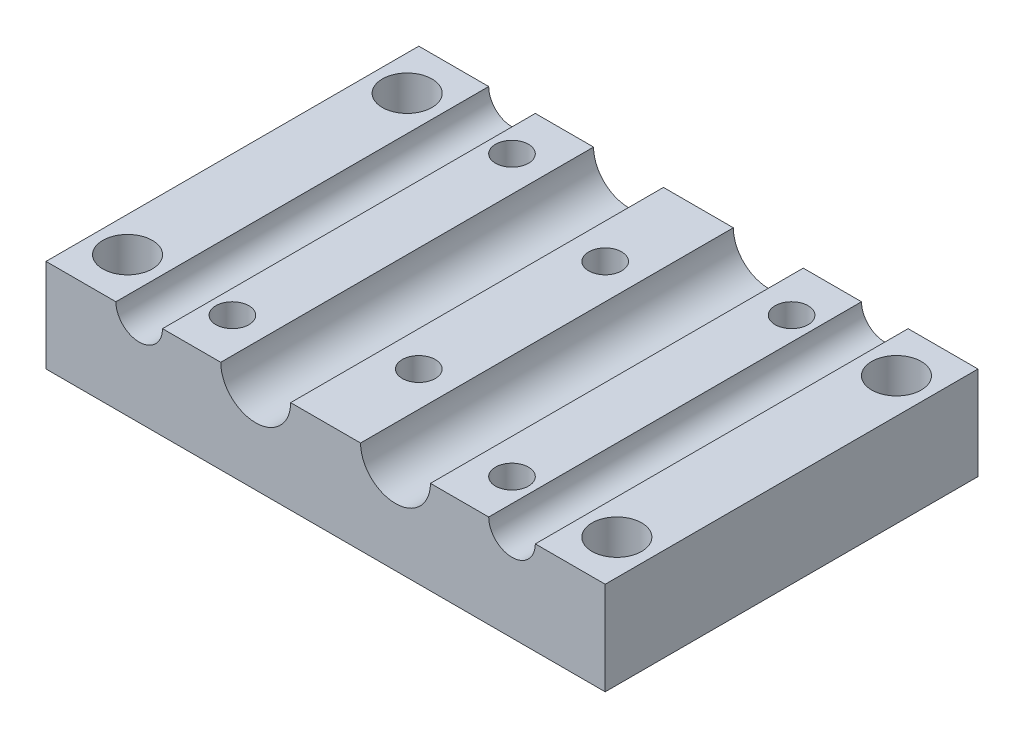
ISO-10303-21;
HEADER;
FILE_DESCRIPTION(('STEP AP214'),'2;1');
FILE_NAME('part.step','',(''),(''),'','','');
FILE_SCHEMA(('AUTOMOTIVE_DESIGN { 1 0 10303 214 1 1 1 1 }'));
ENDSEC;
DATA;
#1=APPLICATION_CONTEXT('core data for automotive mechanical design processes');
#2=APPLICATION_PROTOCOL_DEFINITION('international standard','automotive_design',2000,#1);
#3=PRODUCT_CONTEXT('',#1,'mechanical');
#4=PRODUCT('Part','Part','',(#3));
#5=PRODUCT_RELATED_PRODUCT_CATEGORY('part','',(#4));
#6=PRODUCT_DEFINITION_FORMATION('','',#4);
#7=PRODUCT_DEFINITION_CONTEXT('part definition',#1,'design');
#8=PRODUCT_DEFINITION('design','',#6,#7);
#9=PRODUCT_DEFINITION_SHAPE('','',#8);
#10=(LENGTH_UNIT() NAMED_UNIT(*) SI_UNIT(.MILLI.,.METRE.));
#11=(NAMED_UNIT(*) PLANE_ANGLE_UNIT() SI_UNIT($,.RADIAN.));
#12=(NAMED_UNIT(*) SI_UNIT($,.STERADIAN.) SOLID_ANGLE_UNIT());
#13=UNCERTAINTY_MEASURE_WITH_UNIT(LENGTH_MEASURE(1.E-05),#10,'distance_accuracy_value','');
#14=(GEOMETRIC_REPRESENTATION_CONTEXT(3) GLOBAL_UNCERTAINTY_ASSIGNED_CONTEXT((#13)) GLOBAL_UNIT_ASSIGNED_CONTEXT((#10,
#11,#12)) REPRESENTATION_CONTEXT('',''));
#15=CARTESIAN_POINT('',(0.,0.,0.));
#16=DIRECTION('',(0.,0.,1.));
#17=DIRECTION('',(1.,0.,0.));
#18=AXIS2_PLACEMENT_3D('',#15,#16,#17);
#19=CARTESIAN_POINT('',(0.,12.7,-12.7));
#20=DIRECTION('',(0.,1.,0.));
#21=DIRECTION('',(0.,0.,1.));
#22=AXIS2_PLACEMENT_3D('',#19,#20,#21);
#23=CYLINDRICAL_SURFACE('',#22,2.2479);
#24=CARTESIAN_POINT('',(0.,12.7,-12.7));
#25=DIRECTION('',(0.,1.,0.));
#26=DIRECTION('',(0.,0.,1.));
#27=AXIS2_PLACEMENT_3D('',#24,#25,#26);
#28=CIRCLE('',#27,2.2479);
#29=CARTESIAN_POINT('',(0.,12.7,-10.4521));
#30=VERTEX_POINT('',#29);
#31=EDGE_CURVE('E223',#30,#30,#28,.T.);
#32=ORIENTED_EDGE('',*,*,#31,.T.);
#33=EDGE_LOOP('',(#32));
#34=FACE_BOUND('',#33,.T.);
#35=CARTESIAN_POINT('',(0.,3.175,-12.7));
#36=DIRECTION('',(0.,-1.,0.));
#37=DIRECTION('',(0.,0.,-1.));
#38=AXIS2_PLACEMENT_3D('',#35,#36,#37);
#39=CIRCLE('',#38,2.2479);
#40=CARTESIAN_POINT('',(0.,3.175,-14.9479));
#41=VERTEX_POINT('',#40);
#42=EDGE_CURVE('E38',#41,#41,#39,.F.);
#43=ORIENTED_EDGE('',*,*,#42,.F.);
#44=EDGE_LOOP('',(#43));
#45=FACE_BOUND('',#44,.T.);
#46=ADVANCED_FACE('F34',(#34,#45),#23,.F.);
#47=CARTESIAN_POINT('',(-19.05,12.7,-19.05));
#48=DIRECTION('',(0.,1.,0.));
#49=DIRECTION('',(0.,0.,1.));
#50=AXIS2_PLACEMENT_3D('',#47,#48,#49);
#51=CYLINDRICAL_SURFACE('',#50,2.2479);
#52=CARTESIAN_POINT('',(-19.05,12.7,-19.05));
#53=DIRECTION('',(0.,1.,0.));
#54=DIRECTION('',(0.,0.,1.));
#55=AXIS2_PLACEMENT_3D('',#52,#53,#54);
#56=CIRCLE('',#55,2.2479);
#57=CARTESIAN_POINT('',(-19.05,12.7,-16.8021));
#58=VERTEX_POINT('',#57);
#59=EDGE_CURVE('E226',#58,#58,#56,.T.);
#60=ORIENTED_EDGE('',*,*,#59,.T.);
#61=EDGE_LOOP('',(#60));
#62=FACE_BOUND('',#61,.T.);
#63=CARTESIAN_POINT('',(-19.05,3.175,-19.05));
#64=DIRECTION('',(0.,-1.,0.));
#65=DIRECTION('',(0.,0.,-1.));
#66=AXIS2_PLACEMENT_3D('',#63,#64,#65);
#67=CIRCLE('',#66,2.2479);
#68=CARTESIAN_POINT('',(-19.05,3.175,-21.2979));
#69=VERTEX_POINT('',#68);
#70=EDGE_CURVE('E258',#69,#69,#67,.F.);
#71=ORIENTED_EDGE('',*,*,#70,.F.);
#72=EDGE_LOOP('',(#71));
#73=FACE_BOUND('',#72,.T.);
#74=ADVANCED_FACE('F280',(#62,#73),#51,.F.);
#75=CARTESIAN_POINT('',(19.05,12.7,-19.05));
#76=DIRECTION('',(0.,1.,0.));
#77=DIRECTION('',(0.,0.,1.));
#78=AXIS2_PLACEMENT_3D('',#75,#76,#77);
#79=CYLINDRICAL_SURFACE('',#78,2.2479);
#80=CARTESIAN_POINT('',(19.05,12.7,-19.05));
#81=DIRECTION('',(0.,1.,0.));
#82=DIRECTION('',(0.,0.,1.));
#83=AXIS2_PLACEMENT_3D('',#80,#81,#82);
#84=CIRCLE('',#83,2.2479);
#85=CARTESIAN_POINT('',(19.05,12.7,-16.8021));
#86=VERTEX_POINT('',#85);
#87=EDGE_CURVE('E214',#86,#86,#84,.T.);
#88=ORIENTED_EDGE('',*,*,#87,.T.);
#89=EDGE_LOOP('',(#88));
#90=FACE_BOUND('',#89,.T.);
#91=CARTESIAN_POINT('',(19.05,3.175,-19.05));
#92=DIRECTION('',(0.,-1.,0.));
#93=DIRECTION('',(0.,0.,-1.));
#94=AXIS2_PLACEMENT_3D('',#91,#92,#93);
#95=CIRCLE('',#94,2.2479);
#96=CARTESIAN_POINT('',(19.05,3.175,-21.2979));
#97=VERTEX_POINT('',#96);
#98=EDGE_CURVE('E251',#97,#97,#95,.F.);
#99=ORIENTED_EDGE('',*,*,#98,.F.);
#100=EDGE_LOOP('',(#99));
#101=FACE_BOUND('',#100,.T.);
#102=ADVANCED_FACE('F287',(#90,#101),#79,.F.);
#103=CARTESIAN_POINT('',(19.05,12.7,19.05));
#104=DIRECTION('',(0.,1.,0.));
#105=DIRECTION('',(0.,0.,1.));
#106=AXIS2_PLACEMENT_3D('',#103,#104,#105);
#107=CYLINDRICAL_SURFACE('',#106,2.2479);
#108=CARTESIAN_POINT('',(19.05,12.7,19.05));
#109=DIRECTION('',(0.,1.,0.));
#110=DIRECTION('',(0.,0.,1.));
#111=AXIS2_PLACEMENT_3D('',#108,#109,#110);
#112=CIRCLE('',#111,2.2479);
#113=CARTESIAN_POINT('',(19.05,12.7,21.2979));
#114=VERTEX_POINT('',#113);
#115=EDGE_CURVE('E217',#114,#114,#112,.T.);
#116=ORIENTED_EDGE('',*,*,#115,.T.);
#117=EDGE_LOOP('',(#116));
#118=FACE_BOUND('',#117,.T.);
#119=CARTESIAN_POINT('',(19.05,3.175,19.05));
#120=DIRECTION('',(0.,-1.,0.));
#121=DIRECTION('',(0.,0.,-1.));
#122=AXIS2_PLACEMENT_3D('',#119,#120,#121);
#123=CIRCLE('',#122,2.2479);
#124=CARTESIAN_POINT('',(19.05,3.175,16.8021));
#125=VERTEX_POINT('',#124);
#126=EDGE_CURVE('E244',#125,#125,#123,.F.);
#127=ORIENTED_EDGE('',*,*,#126,.F.);
#128=EDGE_LOOP('',(#127));
#129=FACE_BOUND('',#128,.T.);
#130=ADVANCED_FACE('F296',(#118,#129),#107,.F.);
#131=CARTESIAN_POINT('',(0.,12.7,12.7));
#132=DIRECTION('',(0.,1.,0.));
#133=DIRECTION('',(0.,0.,1.));
#134=AXIS2_PLACEMENT_3D('',#131,#132,#133);
#135=CYLINDRICAL_SURFACE('',#134,2.2479);
#136=CARTESIAN_POINT('',(0.,12.7,12.7));
#137=DIRECTION('',(0.,1.,0.));
#138=DIRECTION('',(0.,0.,1.));
#139=AXIS2_PLACEMENT_3D('',#136,#137,#138);
#140=CIRCLE('',#139,2.2479);
#141=CARTESIAN_POINT('',(0.,12.7,14.9479));
#142=VERTEX_POINT('',#141);
#143=EDGE_CURVE('E220',#142,#142,#140,.T.);
#144=ORIENTED_EDGE('',*,*,#143,.T.);
#145=EDGE_LOOP('',(#144));
#146=FACE_BOUND('',#145,.T.);
#147=CARTESIAN_POINT('',(0.,3.175,12.7));
#148=DIRECTION('',(0.,-1.,0.));
#149=DIRECTION('',(0.,0.,-1.));
#150=AXIS2_PLACEMENT_3D('',#147,#148,#149);
#151=CIRCLE('',#150,2.2479);
#152=CARTESIAN_POINT('',(0.,3.175,10.4521));
#153=VERTEX_POINT('',#152);
#154=EDGE_CURVE('E237',#153,#153,#151,.F.);
#155=ORIENTED_EDGE('',*,*,#154,.F.);
#156=EDGE_LOOP('',(#155));
#157=FACE_BOUND('',#156,.T.);
#158=ADVANCED_FACE('F292',(#146,#157),#135,.F.);
#159=CARTESIAN_POINT('',(-19.05,12.7,19.05));
#160=DIRECTION('',(0.,1.,0.));
#161=DIRECTION('',(0.,0.,1.));
#162=AXIS2_PLACEMENT_3D('',#159,#160,#161);
#163=CYLINDRICAL_SURFACE('',#162,2.2479);
#164=CARTESIAN_POINT('',(-19.05,12.7,19.05));
#165=DIRECTION('',(0.,1.,0.));
#166=DIRECTION('',(0.,0.,1.));
#167=AXIS2_PLACEMENT_3D('',#164,#165,#166);
#168=CIRCLE('',#167,2.2479);
#169=CARTESIAN_POINT('',(-19.05,12.7,21.2979));
#170=VERTEX_POINT('',#169);
#171=EDGE_CURVE('E229',#170,#170,#168,.T.);
#172=ORIENTED_EDGE('',*,*,#171,.T.);
#173=EDGE_LOOP('',(#172));
#174=FACE_BOUND('',#173,.T.);
#175=CARTESIAN_POINT('',(-19.05,3.175,19.05));
#176=DIRECTION('',(0.,-1.,0.));
#177=DIRECTION('',(0.,0.,-1.));
#178=AXIS2_PLACEMENT_3D('',#175,#176,#177);
#179=CIRCLE('',#178,2.2479);
#180=CARTESIAN_POINT('',(-19.05,3.175,16.8021));
#181=VERTEX_POINT('',#180);
#182=EDGE_CURVE('E232',#181,#181,#179,.F.);
#183=ORIENTED_EDGE('',*,*,#182,.F.);
#184=EDGE_LOOP('',(#183));
#185=FACE_BOUND('',#184,.T.);
#186=ADVANCED_FACE('F295',(#174,#185),#163,.F.);
#187=CARTESIAN_POINT('',(0.,12.7,0.));
#188=DIRECTION('',(0.,1.,0.));
#189=DIRECTION('',(0.,0.,1.));
#190=AXIS2_PLACEMENT_3D('',#187,#188,#189);
#191=PLANE('',#190);
#192=ORIENTED_EDGE('',*,*,#31,.F.);
#193=EDGE_LOOP('',(#192));
#194=FACE_BOUND('',#193,.T.);
#195=ORIENTED_EDGE('',*,*,#143,.F.);
#196=EDGE_LOOP('',(#195));
#197=FACE_BOUND('',#196,.T.);
#198=DIRECTION('',(0.,0.,1.));
#199=VECTOR('',#198,1.);
#200=CARTESIAN_POINT('',(4.7625,12.7,-25.4));
#201=LINE('',#200,#199);
#202=CARTESIAN_POINT('',(4.7625,12.7,-25.4));
#203=VERTEX_POINT('',#202);
#204=CARTESIAN_POINT('',(4.7625,12.7,25.4));
#205=VERTEX_POINT('',#204);
#206=EDGE_CURVE('E124',#203,#205,#201,.T.);
#207=ORIENTED_EDGE('',*,*,#206,.F.);
#208=DIRECTION('',(-1.,0.,0.));
#209=VECTOR('',#208,1.);
#210=CARTESIAN_POINT('',(-38.1,12.7,-25.4));
#211=LINE('',#210,#209);
#212=CARTESIAN_POINT('',(-4.7625,12.7,-25.4));
#213=VERTEX_POINT('',#212);
#214=EDGE_CURVE('E58',#203,#213,#211,.T.);
#215=ORIENTED_EDGE('',*,*,#214,.T.);
#216=DIRECTION('',(0.,0.,1.));
#217=VECTOR('',#216,1.);
#218=CARTESIAN_POINT('',(-4.7625,12.7,-25.4));
#219=LINE('',#218,#217);
#220=CARTESIAN_POINT('',(-4.7625,12.7,25.4));
#221=VERTEX_POINT('',#220);
#222=EDGE_CURVE('E184',#221,#213,#219,.F.);
#223=ORIENTED_EDGE('',*,*,#222,.F.);
#224=DIRECTION('',(1.,0.,0.));
#225=VECTOR('',#224,1.);
#226=CARTESIAN_POINT('',(-38.1,12.7,25.4));
#227=LINE('',#226,#225);
#228=EDGE_CURVE('E132',#221,#205,#227,.T.);
#229=ORIENTED_EDGE('',*,*,#228,.T.);
#230=EDGE_LOOP('',(#207,#215,#223,#229));
#231=FACE_BOUND('',#230,.T.);
#232=ADVANCED_FACE('F130',(#194,#197,#231),#191,.T.);
#233=ORIENTED_EDGE('',*,*,#171,.F.);
#234=EDGE_LOOP('',(#233));
#235=FACE_BOUND('',#234,.T.);
#236=ORIENTED_EDGE('',*,*,#59,.F.);
#237=EDGE_LOOP('',(#236));
#238=FACE_BOUND('',#237,.T.);
#239=DIRECTION('',(0.,0.,1.));
#240=VECTOR('',#239,1.);
#241=CARTESIAN_POINT('',(-14.2875,12.7,-25.4));
#242=LINE('',#241,#240);
#243=CARTESIAN_POINT('',(-14.2875,12.7,-25.4));
#244=VERTEX_POINT('',#243);
#245=CARTESIAN_POINT('',(-14.2875,12.7,25.4));
#246=VERTEX_POINT('',#245);
#247=EDGE_CURVE('E180',#244,#246,#242,.T.);
#248=ORIENTED_EDGE('',*,*,#247,.F.);
#249=CARTESIAN_POINT('',(-22.225,12.7,-25.4));
#250=VERTEX_POINT('',#249);
#251=EDGE_CURVE('E139',#244,#250,#211,.T.);
#252=ORIENTED_EDGE('',*,*,#251,.T.);
#253=DIRECTION('',(0.,0.,1.));
#254=VECTOR('',#253,1.);
#255=CARTESIAN_POINT('',(-22.225,12.7,-25.4));
#256=LINE('',#255,#254);
#257=CARTESIAN_POINT('',(-22.225,12.7,25.4));
#258=VERTEX_POINT('',#257);
#259=EDGE_CURVE('E369',#258,#250,#256,.F.);
#260=ORIENTED_EDGE('',*,*,#259,.F.);
#261=EDGE_CURVE('E163',#258,#246,#227,.T.);
#262=ORIENTED_EDGE('',*,*,#261,.T.);
#263=EDGE_LOOP('',(#248,#252,#260,#262));
#264=FACE_BOUND('',#263,.T.);
#265=ADVANCED_FACE('F367',(#235,#238,#264),#191,.T.);
#266=ORIENTED_EDGE('',*,*,#115,.F.);
#267=EDGE_LOOP('',(#266));
#268=FACE_BOUND('',#267,.T.);
#269=ORIENTED_EDGE('',*,*,#87,.F.);
#270=EDGE_LOOP('',(#269));
#271=FACE_BOUND('',#270,.T.);
#272=DIRECTION('',(0.,0.,1.));
#273=VECTOR('',#272,1.);
#274=CARTESIAN_POINT('',(14.2875,12.7,-25.4));
#275=LINE('',#274,#273);
#276=CARTESIAN_POINT('',(14.2875,12.7,25.4));
#277=VERTEX_POINT('',#276);
#278=CARTESIAN_POINT('',(14.2875,12.7,-25.4));
#279=VERTEX_POINT('',#278);
#280=EDGE_CURVE('E51',#277,#279,#275,.F.);
#281=ORIENTED_EDGE('',*,*,#280,.F.);
#282=CARTESIAN_POINT('',(22.225,12.7,25.4));
#283=VERTEX_POINT('',#282);
#284=EDGE_CURVE('E165',#277,#283,#227,.T.);
#285=ORIENTED_EDGE('',*,*,#284,.T.);
#286=DIRECTION('',(0.,0.,1.));
#287=VECTOR('',#286,1.);
#288=CARTESIAN_POINT('',(22.225,12.7,-25.4));
#289=LINE('',#288,#287);
#290=CARTESIAN_POINT('',(22.225,12.7,-25.4));
#291=VERTEX_POINT('',#290);
#292=EDGE_CURVE('E372',#291,#283,#289,.T.);
#293=ORIENTED_EDGE('',*,*,#292,.F.);
#294=EDGE_CURVE('E138',#291,#279,#211,.T.);
#295=ORIENTED_EDGE('',*,*,#294,.T.);
#296=EDGE_LOOP('',(#281,#285,#293,#295));
#297=FACE_BOUND('',#296,.T.);
#298=ADVANCED_FACE('F446',(#268,#271,#297),#191,.T.);
#299=CARTESIAN_POINT('',(-33.3375,12.7,19.05));
#300=DIRECTION('',(0.,1.,0.));
#301=DIRECTION('',(0.,0.,1.));
#302=AXIS2_PLACEMENT_3D('',#299,#300,#301);
#303=CIRCLE('',#302,3.37819999999999);
#304=CARTESIAN_POINT('',(-33.3375,12.7,22.4282));
#305=VERTEX_POINT('',#304);
#306=EDGE_CURVE('E211',#305,#305,#303,.T.);
#307=ORIENTED_EDGE('',*,*,#306,.F.);
#308=EDGE_LOOP('',(#307));
#309=FACE_BOUND('',#308,.T.);
#310=CARTESIAN_POINT('',(-33.3375,12.7,-19.05));
#311=DIRECTION('',(0.,1.,0.));
#312=DIRECTION('',(0.,0.,1.));
#313=AXIS2_PLACEMENT_3D('',#310,#311,#312);
#314=CIRCLE('',#313,3.37819999999999);
#315=CARTESIAN_POINT('',(-33.3375,12.7,-15.6718));
#316=VERTEX_POINT('',#315);
#317=EDGE_CURVE('E205',#316,#316,#314,.T.);
#318=ORIENTED_EDGE('',*,*,#317,.F.);
#319=EDGE_LOOP('',(#318));
#320=FACE_BOUND('',#319,.T.);
#321=DIRECTION('',(0.,0.,1.));
#322=VECTOR('',#321,1.);
#323=CARTESIAN_POINT('',(-28.575,12.7,-25.4));
#324=LINE('',#323,#322);
#325=CARTESIAN_POINT('',(-28.575,12.7,-25.4));
#326=VERTEX_POINT('',#325);
#327=CARTESIAN_POINT('',(-28.575,12.7,25.4));
#328=VERTEX_POINT('',#327);
#329=EDGE_CURVE('E460',#326,#328,#324,.T.);
#330=ORIENTED_EDGE('',*,*,#329,.F.);
#331=CARTESIAN_POINT('',(-38.1,12.7,-25.4));
#332=VERTEX_POINT('',#331);
#333=EDGE_CURVE('E142',#326,#332,#211,.T.);
#334=ORIENTED_EDGE('',*,*,#333,.T.);
#335=DIRECTION('',(0.,0.,1.));
#336=VECTOR('',#335,1.);
#337=CARTESIAN_POINT('',(-38.1,12.7,-25.4));
#338=LINE('',#337,#336);
#339=CARTESIAN_POINT('',(-38.1,12.7,25.4));
#340=VERTEX_POINT('',#339);
#341=EDGE_CURVE('E167',#332,#340,#338,.T.);
#342=ORIENTED_EDGE('',*,*,#341,.T.);
#343=EDGE_CURVE('E159',#340,#328,#227,.T.);
#344=ORIENTED_EDGE('',*,*,#343,.T.);
#345=EDGE_LOOP('',(#330,#334,#342,#344));
#346=FACE_BOUND('',#345,.T.);
#347=ADVANCED_FACE('F339',(#309,#320,#346),#191,.T.);
#348=CARTESIAN_POINT('',(-38.1,12.7,-25.4));
#349=DIRECTION('',(1.,0.,0.));
#350=DIRECTION('',(0.,0.,-1.));
#351=AXIS2_PLACEMENT_3D('',#348,#349,#350);
#352=PLANE('',#351);
#353=DIRECTION('',(0.,0.,1.));
#354=VECTOR('',#353,1.);
#355=CARTESIAN_POINT('',(-38.1,0.,-25.4));
#356=LINE('',#355,#354);
#357=CARTESIAN_POINT('',(-38.1,0.,-25.4));
#358=VERTEX_POINT('',#357);
#359=CARTESIAN_POINT('',(-38.1,0.,25.4));
#360=VERTEX_POINT('',#359);
#361=EDGE_CURVE('E177',#358,#360,#356,.T.);
#362=ORIENTED_EDGE('',*,*,#361,.T.);
#363=DIRECTION('',(0.,-1.,0.));
#364=VECTOR('',#363,1.);
#365=CARTESIAN_POINT('',(-38.1,12.7,25.4));
#366=LINE('',#365,#364);
#367=EDGE_CURVE('E464',#340,#360,#366,.T.);
#368=ORIENTED_EDGE('',*,*,#367,.F.);
#369=ORIENTED_EDGE('',*,*,#341,.F.);
#370=DIRECTION('',(0.,-1.,0.));
#371=VECTOR('',#370,1.);
#372=CARTESIAN_POINT('',(-38.1,12.7,-25.4));
#373=LINE('',#372,#371);
#374=EDGE_CURVE('E146',#332,#358,#373,.T.);
#375=ORIENTED_EDGE('',*,*,#374,.T.);
#376=EDGE_LOOP('',(#362,#368,#369,#375));
#377=FACE_BOUND('',#376,.T.);
#378=ADVANCED_FACE('F36',(#377),#352,.F.);
#379=CARTESIAN_POINT('',(-38.1,12.7,25.4));
#380=DIRECTION('',(0.,0.,-1.));
#381=DIRECTION('',(-1.,0.,0.));
#382=AXIS2_PLACEMENT_3D('',#379,#380,#381);
#383=PLANE('',#382);
#384=ORIENTED_EDGE('',*,*,#284,.F.);
#385=CARTESIAN_POINT('',(9.525,12.7,25.4));
#386=DIRECTION('',(0.,0.,1.));
#387=DIRECTION('',(1.,0.,0.));
#388=AXIS2_PLACEMENT_3D('',#385,#386,#387);
#389=CIRCLE('',#388,4.7625);
#390=EDGE_CURVE('E188',#205,#277,#389,.T.);
#391=ORIENTED_EDGE('',*,*,#390,.F.);
#392=ORIENTED_EDGE('',*,*,#228,.F.);
#393=CARTESIAN_POINT('',(-9.525,12.7,25.4));
#394=DIRECTION('',(0.,0.,1.));
#395=DIRECTION('',(1.,0.,0.));
#396=AXIS2_PLACEMENT_3D('',#393,#394,#395);
#397=CIRCLE('',#396,4.7625);
#398=EDGE_CURVE('E133',#246,#221,#397,.T.);
#399=ORIENTED_EDGE('',*,*,#398,.F.);
#400=ORIENTED_EDGE('',*,*,#261,.F.);
#401=CARTESIAN_POINT('',(-25.4,12.7,25.4));
#402=DIRECTION('',(0.,0.,1.));
#403=DIRECTION('',(1.,0.,0.));
#404=AXIS2_PLACEMENT_3D('',#401,#402,#403);
#405=CIRCLE('',#404,3.175);
#406=EDGE_CURVE('E171',#328,#258,#405,.T.);
#407=ORIENTED_EDGE('',*,*,#406,.F.);
#408=ORIENTED_EDGE('',*,*,#343,.F.);
#409=ORIENTED_EDGE('',*,*,#367,.T.);
#410=DIRECTION('',(1.,0.,0.));
#411=VECTOR('',#410,1.);
#412=CARTESIAN_POINT('',(-38.1,0.,25.4));
#413=LINE('',#412,#411);
#414=CARTESIAN_POINT('',(38.1,0.,25.4));
#415=VERTEX_POINT('',#414);
#416=EDGE_CURVE('E474',#360,#415,#413,.T.);
#417=ORIENTED_EDGE('',*,*,#416,.T.);
#418=DIRECTION('',(0.,-1.,0.));
#419=VECTOR('',#418,1.);
#420=CARTESIAN_POINT('',(38.1,12.7,25.4));
#421=LINE('',#420,#419);
#422=CARTESIAN_POINT('',(38.1,12.7,25.4));
#423=VERTEX_POINT('',#422);
#424=EDGE_CURVE('E467',#423,#415,#421,.T.);
#425=ORIENTED_EDGE('',*,*,#424,.F.);
#426=CARTESIAN_POINT('',(28.575,12.7,25.4));
#427=VERTEX_POINT('',#426);
#428=EDGE_CURVE('E169',#427,#423,#227,.T.);
#429=ORIENTED_EDGE('',*,*,#428,.F.);
#430=CARTESIAN_POINT('',(25.4,12.7,25.4));
#431=DIRECTION('',(0.,0.,1.));
#432=DIRECTION('',(1.,0.,0.));
#433=AXIS2_PLACEMENT_3D('',#430,#431,#432);
#434=CIRCLE('',#433,3.175);
#435=EDGE_CURVE('E178',#283,#427,#434,.T.);
#436=ORIENTED_EDGE('',*,*,#435,.F.);
#437=EDGE_LOOP('',(#384,#391,#392,#399,#400,#407,#408,#409,#417,#425,#429,#436));
#438=FACE_BOUND('',#437,.T.);
#439=ADVANCED_FACE('F347',(#438),#383,.F.);
#440=CARTESIAN_POINT('',(38.1,12.7,-25.4));
#441=DIRECTION('',(-1.,0.,0.));
#442=DIRECTION('',(0.,0.,1.));
#443=AXIS2_PLACEMENT_3D('',#440,#441,#442);
#444=PLANE('',#443);
#445=DIRECTION('',(0.,0.,-1.));
#446=VECTOR('',#445,1.);
#447=CARTESIAN_POINT('',(38.1,0.,-25.4));
#448=LINE('',#447,#446);
#449=CARTESIAN_POINT('',(38.1,0.,-25.4));
#450=VERTEX_POINT('',#449);
#451=EDGE_CURVE('E472',#415,#450,#448,.T.);
#452=ORIENTED_EDGE('',*,*,#451,.T.);
#453=DIRECTION('',(0.,-1.,0.));
#454=VECTOR('',#453,1.);
#455=CARTESIAN_POINT('',(38.1,12.7,-25.4));
#456=LINE('',#455,#454);
#457=CARTESIAN_POINT('',(38.1,12.7,-25.4));
#458=VERTEX_POINT('',#457);
#459=EDGE_CURVE('E151',#458,#450,#456,.T.);
#460=ORIENTED_EDGE('',*,*,#459,.F.);
#461=DIRECTION('',(0.,0.,-1.));
#462=VECTOR('',#461,1.);
#463=CARTESIAN_POINT('',(38.1,12.7,-25.4));
#464=LINE('',#463,#462);
#465=EDGE_CURVE('E153',#423,#458,#464,.T.);
#466=ORIENTED_EDGE('',*,*,#465,.F.);
#467=ORIENTED_EDGE('',*,*,#424,.T.);
#468=EDGE_LOOP('',(#452,#460,#466,#467));
#469=FACE_BOUND('',#468,.T.);
#470=ADVANCED_FACE('F345',(#469),#444,.F.);
#471=CARTESIAN_POINT('',(-38.1,12.7,-25.4));
#472=DIRECTION('',(0.,0.,1.));
#473=DIRECTION('',(1.,0.,0.));
#474=AXIS2_PLACEMENT_3D('',#471,#472,#473);
#475=PLANE('',#474);
#476=ORIENTED_EDGE('',*,*,#214,.F.);
#477=CARTESIAN_POINT('',(9.525,12.7,-25.4));
#478=DIRECTION('',(0.,0.,1.));
#479=DIRECTION('',(1.,0.,0.));
#480=AXIS2_PLACEMENT_3D('',#477,#478,#479);
#481=CIRCLE('',#480,4.7625);
#482=EDGE_CURVE('E11',#203,#279,#481,.T.);
#483=ORIENTED_EDGE('',*,*,#482,.T.);
#484=ORIENTED_EDGE('',*,*,#294,.F.);
#485=CARTESIAN_POINT('',(25.4,12.7,-25.4));
#486=DIRECTION('',(0.,0.,1.));
#487=DIRECTION('',(1.,0.,0.));
#488=AXIS2_PLACEMENT_3D('',#485,#486,#487);
#489=CIRCLE('',#488,3.175);
#490=CARTESIAN_POINT('',(28.575,12.7,-25.4));
#491=VERTEX_POINT('',#490);
#492=EDGE_CURVE('E174',#291,#491,#489,.T.);
#493=ORIENTED_EDGE('',*,*,#492,.T.);
#494=EDGE_CURVE('E141',#458,#491,#211,.T.);
#495=ORIENTED_EDGE('',*,*,#494,.F.);
#496=ORIENTED_EDGE('',*,*,#459,.T.);
#497=DIRECTION('',(-1.,0.,0.));
#498=VECTOR('',#497,1.);
#499=CARTESIAN_POINT('',(-38.1,0.,-25.4));
#500=LINE('',#499,#498);
#501=EDGE_CURVE('E170',#450,#358,#500,.T.);
#502=ORIENTED_EDGE('',*,*,#501,.T.);
#503=ORIENTED_EDGE('',*,*,#374,.F.);
#504=ORIENTED_EDGE('',*,*,#333,.F.);
#505=CARTESIAN_POINT('',(-25.4,12.7,-25.4));
#506=DIRECTION('',(0.,0.,1.));
#507=DIRECTION('',(1.,0.,0.));
#508=AXIS2_PLACEMENT_3D('',#505,#506,#507);
#509=CIRCLE('',#508,3.175);
#510=EDGE_CURVE('E173',#326,#250,#509,.T.);
#511=ORIENTED_EDGE('',*,*,#510,.T.);
#512=ORIENTED_EDGE('',*,*,#251,.F.);
#513=CARTESIAN_POINT('',(-9.525,12.7,-25.4));
#514=DIRECTION('',(0.,0.,1.));
#515=DIRECTION('',(1.,0.,0.));
#516=AXIS2_PLACEMENT_3D('',#513,#514,#515);
#517=CIRCLE('',#516,4.7625);
#518=EDGE_CURVE('E43',#244,#213,#517,.T.);
#519=ORIENTED_EDGE('',*,*,#518,.T.);
#520=EDGE_LOOP('',(#476,#483,#484,#493,#495,#496,#502,#503,#504,#511,#512,#519));
#521=FACE_BOUND('',#520,.T.);
#522=ADVANCED_FACE('F136',(#521),#475,.F.);
#523=CARTESIAN_POINT('',(33.3375,12.7,-19.05));
#524=DIRECTION('',(0.,1.,0.));
#525=DIRECTION('',(0.,0.,1.));
#526=AXIS2_PLACEMENT_3D('',#523,#524,#525);
#527=CIRCLE('',#526,3.37819999999999);
#528=CARTESIAN_POINT('',(33.3375,12.7,-15.6718));
#529=VERTEX_POINT('',#528);
#530=EDGE_CURVE('E199',#529,#529,#527,.T.);
#531=ORIENTED_EDGE('',*,*,#530,.F.);
#532=EDGE_LOOP('',(#531));
#533=FACE_BOUND('',#532,.T.);
#534=CARTESIAN_POINT('',(33.3375,12.7,19.05));
#535=DIRECTION('',(0.,1.,0.));
#536=DIRECTION('',(0.,0.,1.));
#537=AXIS2_PLACEMENT_3D('',#534,#535,#536);
#538=CIRCLE('',#537,3.37819999999999);
#539=CARTESIAN_POINT('',(33.3375,12.7,22.4282));
#540=VERTEX_POINT('',#539);
#541=EDGE_CURVE('E193',#540,#540,#538,.T.);
#542=ORIENTED_EDGE('',*,*,#541,.F.);
#543=EDGE_LOOP('',(#542));
#544=FACE_BOUND('',#543,.T.);
#545=DIRECTION('',(0.,0.,1.));
#546=VECTOR('',#545,1.);
#547=CARTESIAN_POINT('',(28.575,12.7,-25.4));
#548=LINE('',#547,#546);
#549=EDGE_CURVE('E374',#427,#491,#548,.F.);
#550=ORIENTED_EDGE('',*,*,#549,.F.);
#551=ORIENTED_EDGE('',*,*,#428,.T.);
#552=ORIENTED_EDGE('',*,*,#465,.T.);
#553=ORIENTED_EDGE('',*,*,#494,.T.);
#554=EDGE_LOOP('',(#550,#551,#552,#553));
#555=FACE_BOUND('',#554,.T.);
#556=ADVANCED_FACE('F335',(#533,#544,#555),#191,.T.);
#557=CARTESIAN_POINT('',(0.,0.,0.));
#558=DIRECTION('',(0.,1.,0.));
#559=DIRECTION('',(0.,0.,1.));
#560=AXIS2_PLACEMENT_3D('',#557,#558,#559);
#561=PLANE('',#560);
#562=CARTESIAN_POINT('',(0.,0.,-12.7));
#563=DIRECTION('',(0.,-1.,0.));
#564=DIRECTION('',(0.,0.,-1.));
#565=AXIS2_PLACEMENT_3D('',#562,#563,#564);
#566=CIRCLE('',#565,6.096);
#567=CARTESIAN_POINT('',(0.,0.,-18.796));
#568=VERTEX_POINT('',#567);
#569=EDGE_CURVE('E267',#568,#568,#566,.T.);
#570=ORIENTED_EDGE('',*,*,#569,.F.);
#571=EDGE_LOOP('',(#570));
#572=FACE_BOUND('',#571,.T.);
#573=CARTESIAN_POINT('',(-19.05,0.,-19.05));
#574=DIRECTION('',(0.,-1.,0.));
#575=DIRECTION('',(0.,0.,-1.));
#576=AXIS2_PLACEMENT_3D('',#573,#574,#575);
#577=CIRCLE('',#576,6.096);
#578=CARTESIAN_POINT('',(-19.05,0.,-25.146));
#579=VERTEX_POINT('',#578);
#580=EDGE_CURVE('E261',#579,#579,#577,.T.);
#581=ORIENTED_EDGE('',*,*,#580,.F.);
#582=EDGE_LOOP('',(#581));
#583=FACE_BOUND('',#582,.T.);
#584=CARTESIAN_POINT('',(19.05,0.,-19.05));
#585=DIRECTION('',(0.,-1.,0.));
#586=DIRECTION('',(0.,0.,-1.));
#587=AXIS2_PLACEMENT_3D('',#584,#585,#586);
#588=CIRCLE('',#587,6.096);
#589=CARTESIAN_POINT('',(19.05,0.,-25.146));
#590=VERTEX_POINT('',#589);
#591=EDGE_CURVE('E254',#590,#590,#588,.T.);
#592=ORIENTED_EDGE('',*,*,#591,.F.);
#593=EDGE_LOOP('',(#592));
#594=FACE_BOUND('',#593,.T.);
#595=CARTESIAN_POINT('',(19.05,0.,19.05));
#596=DIRECTION('',(0.,-1.,0.));
#597=DIRECTION('',(0.,0.,-1.));
#598=AXIS2_PLACEMENT_3D('',#595,#596,#597);
#599=CIRCLE('',#598,6.096);
#600=CARTESIAN_POINT('',(19.05,0.,12.954));
#601=VERTEX_POINT('',#600);
#602=EDGE_CURVE('E247',#601,#601,#599,.T.);
#603=ORIENTED_EDGE('',*,*,#602,.F.);
#604=EDGE_LOOP('',(#603));
#605=FACE_BOUND('',#604,.T.);
#606=CARTESIAN_POINT('',(0.,0.,12.7));
#607=DIRECTION('',(0.,-1.,0.));
#608=DIRECTION('',(0.,0.,-1.));
#609=AXIS2_PLACEMENT_3D('',#606,#607,#608);
#610=CIRCLE('',#609,6.096);
#611=CARTESIAN_POINT('',(0.,0.,6.604));
#612=VERTEX_POINT('',#611);
#613=EDGE_CURVE('E240',#612,#612,#610,.T.);
#614=ORIENTED_EDGE('',*,*,#613,.F.);
#615=EDGE_LOOP('',(#614));
#616=FACE_BOUND('',#615,.T.);
#617=CARTESIAN_POINT('',(-19.05,0.,19.05));
#618=DIRECTION('',(0.,-1.,0.));
#619=DIRECTION('',(0.,0.,-1.));
#620=AXIS2_PLACEMENT_3D('',#617,#618,#619);
#621=CIRCLE('',#620,6.096);
#622=CARTESIAN_POINT('',(-19.05,0.,12.954));
#623=VERTEX_POINT('',#622);
#624=EDGE_CURVE('E233',#623,#623,#621,.T.);
#625=ORIENTED_EDGE('',*,*,#624,.F.);
#626=EDGE_LOOP('',(#625));
#627=FACE_BOUND('',#626,.T.);
#628=CARTESIAN_POINT('',(-33.3375,0.,19.05));
#629=DIRECTION('',(0.,1.,0.));
#630=DIRECTION('',(0.,0.,1.));
#631=AXIS2_PLACEMENT_3D('',#628,#629,#630);
#632=CIRCLE('',#631,3.37819999999999);
#633=CARTESIAN_POINT('',(-33.3375,0.,22.4282));
#634=VERTEX_POINT('',#633);
#635=EDGE_CURVE('E208',#634,#634,#632,.T.);
#636=ORIENTED_EDGE('',*,*,#635,.T.);
#637=EDGE_LOOP('',(#636));
#638=FACE_BOUND('',#637,.T.);
#639=CARTESIAN_POINT('',(-33.3375,0.,-19.05));
#640=DIRECTION('',(0.,1.,0.));
#641=DIRECTION('',(0.,0.,1.));
#642=AXIS2_PLACEMENT_3D('',#639,#640,#641);
#643=CIRCLE('',#642,3.37819999999999);
#644=CARTESIAN_POINT('',(-33.3375,0.,-15.6718));
#645=VERTEX_POINT('',#644);
#646=EDGE_CURVE('E202',#645,#645,#643,.T.);
#647=ORIENTED_EDGE('',*,*,#646,.T.);
#648=EDGE_LOOP('',(#647));
#649=FACE_BOUND('',#648,.T.);
#650=CARTESIAN_POINT('',(33.3375,0.,-19.05));
#651=DIRECTION('',(0.,1.,0.));
#652=DIRECTION('',(0.,0.,1.));
#653=AXIS2_PLACEMENT_3D('',#650,#651,#652);
#654=CIRCLE('',#653,3.37819999999999);
#655=CARTESIAN_POINT('',(33.3375,0.,-15.6718));
#656=VERTEX_POINT('',#655);
#657=EDGE_CURVE('E196',#656,#656,#654,.T.);
#658=ORIENTED_EDGE('',*,*,#657,.T.);
#659=EDGE_LOOP('',(#658));
#660=FACE_BOUND('',#659,.T.);
#661=CARTESIAN_POINT('',(33.3375,0.,19.05));
#662=DIRECTION('',(0.,1.,0.));
#663=DIRECTION('',(0.,0.,1.));
#664=AXIS2_PLACEMENT_3D('',#661,#662,#663);
#665=CIRCLE('',#664,3.37819999999999);
#666=CARTESIAN_POINT('',(33.3375,0.,22.4282));
#667=VERTEX_POINT('',#666);
#668=EDGE_CURVE('E190',#667,#667,#665,.T.);
#669=ORIENTED_EDGE('',*,*,#668,.T.);
#670=EDGE_LOOP('',(#669));
#671=FACE_BOUND('',#670,.T.);
#672=ORIENTED_EDGE('',*,*,#361,.F.);
#673=ORIENTED_EDGE('',*,*,#501,.F.);
#674=ORIENTED_EDGE('',*,*,#451,.F.);
#675=ORIENTED_EDGE('',*,*,#416,.F.);
#676=EDGE_LOOP('',(#672,#673,#674,#675));
#677=FACE_BOUND('',#676,.T.);
#678=ADVANCED_FACE('F333',(#572,#583,#594,#605,#616,#627,#638,#649,#660,#671,#677),#561,.F.);
#679=CARTESIAN_POINT('',(-25.4,12.7,-25.4));
#680=DIRECTION('',(0.,0.,1.));
#681=DIRECTION('',(1.,0.,0.));
#682=AXIS2_PLACEMENT_3D('',#679,#680,#681);
#683=CYLINDRICAL_SURFACE('',#682,3.175);
#684=ORIENTED_EDGE('',*,*,#329,.T.);
#685=ORIENTED_EDGE('',*,*,#406,.T.);
#686=ORIENTED_EDGE('',*,*,#259,.T.);
#687=ORIENTED_EDGE('',*,*,#510,.F.);
#688=EDGE_LOOP('',(#684,#685,#686,#687));
#689=FACE_BOUND('',#688,.T.);
#690=ADVANCED_FACE('F329',(#689),#683,.F.);
#691=CARTESIAN_POINT('',(25.4,12.7,-25.4));
#692=DIRECTION('',(0.,0.,1.));
#693=DIRECTION('',(1.,0.,0.));
#694=AXIS2_PLACEMENT_3D('',#691,#692,#693);
#695=CYLINDRICAL_SURFACE('',#694,3.175);
#696=ORIENTED_EDGE('',*,*,#292,.T.);
#697=ORIENTED_EDGE('',*,*,#435,.T.);
#698=ORIENTED_EDGE('',*,*,#549,.T.);
#699=ORIENTED_EDGE('',*,*,#492,.F.);
#700=EDGE_LOOP('',(#696,#697,#698,#699));
#701=FACE_BOUND('',#700,.T.);
#702=ADVANCED_FACE('F325',(#701),#695,.F.);
#703=CARTESIAN_POINT('',(-9.525,12.7,-25.4));
#704=DIRECTION('',(0.,0.,1.));
#705=DIRECTION('',(1.,0.,0.));
#706=AXIS2_PLACEMENT_3D('',#703,#704,#705);
#707=CYLINDRICAL_SURFACE('',#706,4.7625);
#708=ORIENTED_EDGE('',*,*,#247,.T.);
#709=ORIENTED_EDGE('',*,*,#398,.T.);
#710=ORIENTED_EDGE('',*,*,#222,.T.);
#711=ORIENTED_EDGE('',*,*,#518,.F.);
#712=EDGE_LOOP('',(#708,#709,#710,#711));
#713=FACE_BOUND('',#712,.T.);
#714=ADVANCED_FACE('F322',(#713),#707,.F.);
#715=CARTESIAN_POINT('',(9.525,12.7,-25.4));
#716=DIRECTION('',(0.,0.,1.));
#717=DIRECTION('',(1.,0.,0.));
#718=AXIS2_PLACEMENT_3D('',#715,#716,#717);
#719=CYLINDRICAL_SURFACE('',#718,4.7625);
#720=ORIENTED_EDGE('',*,*,#206,.T.);
#721=ORIENTED_EDGE('',*,*,#390,.T.);
#722=ORIENTED_EDGE('',*,*,#280,.T.);
#723=ORIENTED_EDGE('',*,*,#482,.F.);
#724=EDGE_LOOP('',(#720,#721,#722,#723));
#725=FACE_BOUND('',#724,.T.);
#726=ADVANCED_FACE('F123',(#725),#719,.F.);
#727=CARTESIAN_POINT('',(33.3375,12.7,19.05));
#728=DIRECTION('',(0.,1.,0.));
#729=DIRECTION('',(0.,0.,1.));
#730=AXIS2_PLACEMENT_3D('',#727,#728,#729);
#731=CYLINDRICAL_SURFACE('',#730,3.37819999999999);
#732=ORIENTED_EDGE('',*,*,#668,.F.);
#733=EDGE_LOOP('',(#732));
#734=FACE_BOUND('',#733,.T.);
#735=ORIENTED_EDGE('',*,*,#541,.T.);
#736=EDGE_LOOP('',(#735));
#737=FACE_BOUND('',#736,.T.);
#738=ADVANCED_FACE('F315',(#734,#737),#731,.F.);
#739=CARTESIAN_POINT('',(33.3375,12.7,-19.05));
#740=DIRECTION('',(0.,1.,0.));
#741=DIRECTION('',(0.,0.,1.));
#742=AXIS2_PLACEMENT_3D('',#739,#740,#741);
#743=CYLINDRICAL_SURFACE('',#742,3.37819999999999);
#744=ORIENTED_EDGE('',*,*,#657,.F.);
#745=EDGE_LOOP('',(#744));
#746=FACE_BOUND('',#745,.T.);
#747=ORIENTED_EDGE('',*,*,#530,.T.);
#748=EDGE_LOOP('',(#747));
#749=FACE_BOUND('',#748,.T.);
#750=ADVANCED_FACE('F311',(#746,#749),#743,.F.);
#751=CARTESIAN_POINT('',(-33.3375,12.7,-19.05));
#752=DIRECTION('',(0.,1.,0.));
#753=DIRECTION('',(0.,0.,1.));
#754=AXIS2_PLACEMENT_3D('',#751,#752,#753);
#755=CYLINDRICAL_SURFACE('',#754,3.37819999999999);
#756=ORIENTED_EDGE('',*,*,#646,.F.);
#757=EDGE_LOOP('',(#756));
#758=FACE_BOUND('',#757,.T.);
#759=ORIENTED_EDGE('',*,*,#317,.T.);
#760=EDGE_LOOP('',(#759));
#761=FACE_BOUND('',#760,.T.);
#762=ADVANCED_FACE('F307',(#758,#761),#755,.F.);
#763=CARTESIAN_POINT('',(-33.3375,12.7,19.05));
#764=DIRECTION('',(0.,1.,0.));
#765=DIRECTION('',(0.,0.,1.));
#766=AXIS2_PLACEMENT_3D('',#763,#764,#765);
#767=CYLINDRICAL_SURFACE('',#766,3.37819999999999);
#768=ORIENTED_EDGE('',*,*,#635,.F.);
#769=EDGE_LOOP('',(#768));
#770=FACE_BOUND('',#769,.T.);
#771=ORIENTED_EDGE('',*,*,#306,.T.);
#772=EDGE_LOOP('',(#771));
#773=FACE_BOUND('',#772,.T.);
#774=ADVANCED_FACE('F304',(#770,#773),#767,.F.);
#775=CARTESIAN_POINT('',(-19.05,3.175,19.05));
#776=DIRECTION('',(0.,-1.,0.));
#777=DIRECTION('',(0.,0.,-1.));
#778=AXIS2_PLACEMENT_3D('',#775,#776,#777);
#779=PLANE('',#778);
#780=CARTESIAN_POINT('',(-19.05,3.175,19.05));
#781=DIRECTION('',(0.,-1.,0.));
#782=DIRECTION('',(0.,0.,-1.));
#783=AXIS2_PLACEMENT_3D('',#780,#781,#782);
#784=CIRCLE('',#783,6.096);
#785=CARTESIAN_POINT('',(-19.05,3.175,12.954));
#786=VERTEX_POINT('',#785);
#787=EDGE_CURVE('E236',#786,#786,#784,.T.);
#788=ORIENTED_EDGE('',*,*,#787,.T.);
#789=EDGE_LOOP('',(#788));
#790=FACE_BOUND('',#789,.T.);
#791=ORIENTED_EDGE('',*,*,#182,.T.);
#792=EDGE_LOOP('',(#791));
#793=FACE_BOUND('',#792,.T.);
#794=ADVANCED_FACE('F306',(#790,#793),#779,.T.);
#795=CARTESIAN_POINT('',(-19.05,3.175,19.05));
#796=DIRECTION('',(0.,-1.,0.));
#797=DIRECTION('',(0.,0.,-1.));
#798=AXIS2_PLACEMENT_3D('',#795,#796,#797);
#799=CYLINDRICAL_SURFACE('',#798,6.096);
#800=ORIENTED_EDGE('',*,*,#787,.F.);
#801=EDGE_LOOP('',(#800));
#802=FACE_BOUND('',#801,.T.);
#803=ORIENTED_EDGE('',*,*,#624,.T.);
#804=EDGE_LOOP('',(#803));
#805=FACE_BOUND('',#804,.T.);
#806=ADVANCED_FACE('F423',(#802,#805),#799,.F.);
#807=CARTESIAN_POINT('',(0.,3.175,12.7));
#808=DIRECTION('',(0.,-1.,0.));
#809=DIRECTION('',(0.,0.,-1.));
#810=AXIS2_PLACEMENT_3D('',#807,#808,#809);
#811=PLANE('',#810);
#812=CARTESIAN_POINT('',(0.,3.175,12.7));
#813=DIRECTION('',(0.,-1.,0.));
#814=DIRECTION('',(0.,0.,-1.));
#815=AXIS2_PLACEMENT_3D('',#812,#813,#814);
#816=CIRCLE('',#815,6.096);
#817=CARTESIAN_POINT('',(0.,3.175,6.604));
#818=VERTEX_POINT('',#817);
#819=EDGE_CURVE('E243',#818,#818,#816,.T.);
#820=ORIENTED_EDGE('',*,*,#819,.T.);
#821=EDGE_LOOP('',(#820));
#822=FACE_BOUND('',#821,.T.);
#823=ORIENTED_EDGE('',*,*,#154,.T.);
#824=EDGE_LOOP('',(#823));
#825=FACE_BOUND('',#824,.T.);
#826=ADVANCED_FACE('F420',(#822,#825),#811,.T.);
#827=CARTESIAN_POINT('',(0.,3.175,12.7));
#828=DIRECTION('',(0.,-1.,0.));
#829=DIRECTION('',(0.,0.,-1.));
#830=AXIS2_PLACEMENT_3D('',#827,#828,#829);
#831=CYLINDRICAL_SURFACE('',#830,6.096);
#832=ORIENTED_EDGE('',*,*,#819,.F.);
#833=EDGE_LOOP('',(#832));
#834=FACE_BOUND('',#833,.T.);
#835=ORIENTED_EDGE('',*,*,#613,.T.);
#836=EDGE_LOOP('',(#835));
#837=FACE_BOUND('',#836,.T.);
#838=ADVANCED_FACE('F415',(#834,#837),#831,.F.);
#839=CARTESIAN_POINT('',(19.05,3.175,19.05));
#840=DIRECTION('',(0.,-1.,0.));
#841=DIRECTION('',(0.,0.,-1.));
#842=AXIS2_PLACEMENT_3D('',#839,#840,#841);
#843=PLANE('',#842);
#844=CARTESIAN_POINT('',(19.05,3.175,19.05));
#845=DIRECTION('',(0.,-1.,0.));
#846=DIRECTION('',(0.,0.,-1.));
#847=AXIS2_PLACEMENT_3D('',#844,#845,#846);
#848=CIRCLE('',#847,6.096);
#849=CARTESIAN_POINT('',(19.05,3.175,12.954));
#850=VERTEX_POINT('',#849);
#851=EDGE_CURVE('E250',#850,#850,#848,.T.);
#852=ORIENTED_EDGE('',*,*,#851,.T.);
#853=EDGE_LOOP('',(#852));
#854=FACE_BOUND('',#853,.T.);
#855=ORIENTED_EDGE('',*,*,#126,.T.);
#856=EDGE_LOOP('',(#855));
#857=FACE_BOUND('',#856,.T.);
#858=ADVANCED_FACE('F412',(#854,#857),#843,.T.);
#859=CARTESIAN_POINT('',(19.05,3.175,19.05));
#860=DIRECTION('',(0.,-1.,0.));
#861=DIRECTION('',(0.,0.,-1.));
#862=AXIS2_PLACEMENT_3D('',#859,#860,#861);
#863=CYLINDRICAL_SURFACE('',#862,6.096);
#864=ORIENTED_EDGE('',*,*,#851,.F.);
#865=EDGE_LOOP('',(#864));
#866=FACE_BOUND('',#865,.T.);
#867=ORIENTED_EDGE('',*,*,#602,.T.);
#868=EDGE_LOOP('',(#867));
#869=FACE_BOUND('',#868,.T.);
#870=ADVANCED_FACE('F409',(#866,#869),#863,.F.);
#871=CARTESIAN_POINT('',(19.05,3.175,-19.05));
#872=DIRECTION('',(0.,-1.,0.));
#873=DIRECTION('',(0.,0.,-1.));
#874=AXIS2_PLACEMENT_3D('',#871,#872,#873);
#875=PLANE('',#874);
#876=CARTESIAN_POINT('',(19.05,3.175,-19.05));
#877=DIRECTION('',(0.,-1.,0.));
#878=DIRECTION('',(0.,0.,-1.));
#879=AXIS2_PLACEMENT_3D('',#876,#877,#878);
#880=CIRCLE('',#879,6.096);
#881=CARTESIAN_POINT('',(19.05,3.175,-25.146));
#882=VERTEX_POINT('',#881);
#883=EDGE_CURVE('E257',#882,#882,#880,.T.);
#884=ORIENTED_EDGE('',*,*,#883,.T.);
#885=EDGE_LOOP('',(#884));
#886=FACE_BOUND('',#885,.T.);
#887=ORIENTED_EDGE('',*,*,#98,.T.);
#888=EDGE_LOOP('',(#887));
#889=FACE_BOUND('',#888,.T.);
#890=ADVANCED_FACE('F401',(#886,#889),#875,.T.);
#891=CARTESIAN_POINT('',(19.05,3.175,-19.05));
#892=DIRECTION('',(0.,-1.,0.));
#893=DIRECTION('',(0.,0.,-1.));
#894=AXIS2_PLACEMENT_3D('',#891,#892,#893);
#895=CYLINDRICAL_SURFACE('',#894,6.096);
#896=ORIENTED_EDGE('',*,*,#883,.F.);
#897=EDGE_LOOP('',(#896));
#898=FACE_BOUND('',#897,.T.);
#899=ORIENTED_EDGE('',*,*,#591,.T.);
#900=EDGE_LOOP('',(#899));
#901=FACE_BOUND('',#900,.T.);
#902=ADVANCED_FACE('F392',(#898,#901),#895,.F.);
#903=CARTESIAN_POINT('',(-19.05,3.175,-19.05));
#904=DIRECTION('',(0.,-1.,0.));
#905=DIRECTION('',(0.,0.,-1.));
#906=AXIS2_PLACEMENT_3D('',#903,#904,#905);
#907=PLANE('',#906);
#908=CARTESIAN_POINT('',(-19.05,3.175,-19.05));
#909=DIRECTION('',(0.,-1.,0.));
#910=DIRECTION('',(0.,0.,-1.));
#911=AXIS2_PLACEMENT_3D('',#908,#909,#910);
#912=CIRCLE('',#911,6.096);
#913=CARTESIAN_POINT('',(-19.05,3.175,-25.146));
#914=VERTEX_POINT('',#913);
#915=EDGE_CURVE('E264',#914,#914,#912,.T.);
#916=ORIENTED_EDGE('',*,*,#915,.T.);
#917=EDGE_LOOP('',(#916));
#918=FACE_BOUND('',#917,.T.);
#919=ORIENTED_EDGE('',*,*,#70,.T.);
#920=EDGE_LOOP('',(#919));
#921=FACE_BOUND('',#920,.T.);
#922=ADVANCED_FACE('F388',(#918,#921),#907,.T.);
#923=CARTESIAN_POINT('',(-19.05,3.175,-19.05));
#924=DIRECTION('',(0.,-1.,0.));
#925=DIRECTION('',(0.,0.,-1.));
#926=AXIS2_PLACEMENT_3D('',#923,#924,#925);
#927=CYLINDRICAL_SURFACE('',#926,6.096);
#928=ORIENTED_EDGE('',*,*,#915,.F.);
#929=EDGE_LOOP('',(#928));
#930=FACE_BOUND('',#929,.T.);
#931=ORIENTED_EDGE('',*,*,#580,.T.);
#932=EDGE_LOOP('',(#931));
#933=FACE_BOUND('',#932,.T.);
#934=ADVANCED_FACE('F391',(#930,#933),#927,.F.);
#935=CARTESIAN_POINT('',(0.,3.175,-12.7));
#936=DIRECTION('',(0.,-1.,0.));
#937=DIRECTION('',(0.,0.,-1.));
#938=AXIS2_PLACEMENT_3D('',#935,#936,#937);
#939=PLANE('',#938);
#940=CARTESIAN_POINT('',(0.,3.175,-12.7));
#941=DIRECTION('',(0.,-1.,0.));
#942=DIRECTION('',(0.,0.,-1.));
#943=AXIS2_PLACEMENT_3D('',#940,#941,#942);
#944=CIRCLE('',#943,6.096);
#945=CARTESIAN_POINT('',(0.,3.175,-18.796));
#946=VERTEX_POINT('',#945);
#947=EDGE_CURVE('E270',#946,#946,#944,.T.);
#948=ORIENTED_EDGE('',*,*,#947,.T.);
#949=EDGE_LOOP('',(#948));
#950=FACE_BOUND('',#949,.T.);
#951=ORIENTED_EDGE('',*,*,#42,.T.);
#952=EDGE_LOOP('',(#951));
#953=FACE_BOUND('',#952,.T.);
#954=ADVANCED_FACE('F277',(#950,#953),#939,.T.);
#955=CARTESIAN_POINT('',(0.,3.175,-12.7));
#956=DIRECTION('',(0.,-1.,0.));
#957=DIRECTION('',(0.,0.,-1.));
#958=AXIS2_PLACEMENT_3D('',#955,#956,#957);
#959=CYLINDRICAL_SURFACE('',#958,6.096);
#960=ORIENTED_EDGE('',*,*,#947,.F.);
#961=EDGE_LOOP('',(#960));
#962=FACE_BOUND('',#961,.T.);
#963=ORIENTED_EDGE('',*,*,#569,.T.);
#964=EDGE_LOOP('',(#963));
#965=FACE_BOUND('',#964,.T.);
#966=ADVANCED_FACE('F405',(#962,#965),#959,.F.);
#967=CLOSED_SHELL('',(#46,#74,#102,#130,#158,#186,#232,#265,#298,#347,#378,#439,#470,#522,#556,
#678,#690,#702,#714,#726,#738,#750,#762,#774,#794,#806,#826,#838,#858,#870,#890,#902,#922,#934,
#954,#966));
#968=MANIFOLD_SOLID_BREP('B2',#967);
#969=ADVANCED_BREP_SHAPE_REPRESENTATION('',(#18,#968),#14);
#970=SHAPE_DEFINITION_REPRESENTATION(#9,#969);
ENDSEC;
END-ISO-10303-21;
